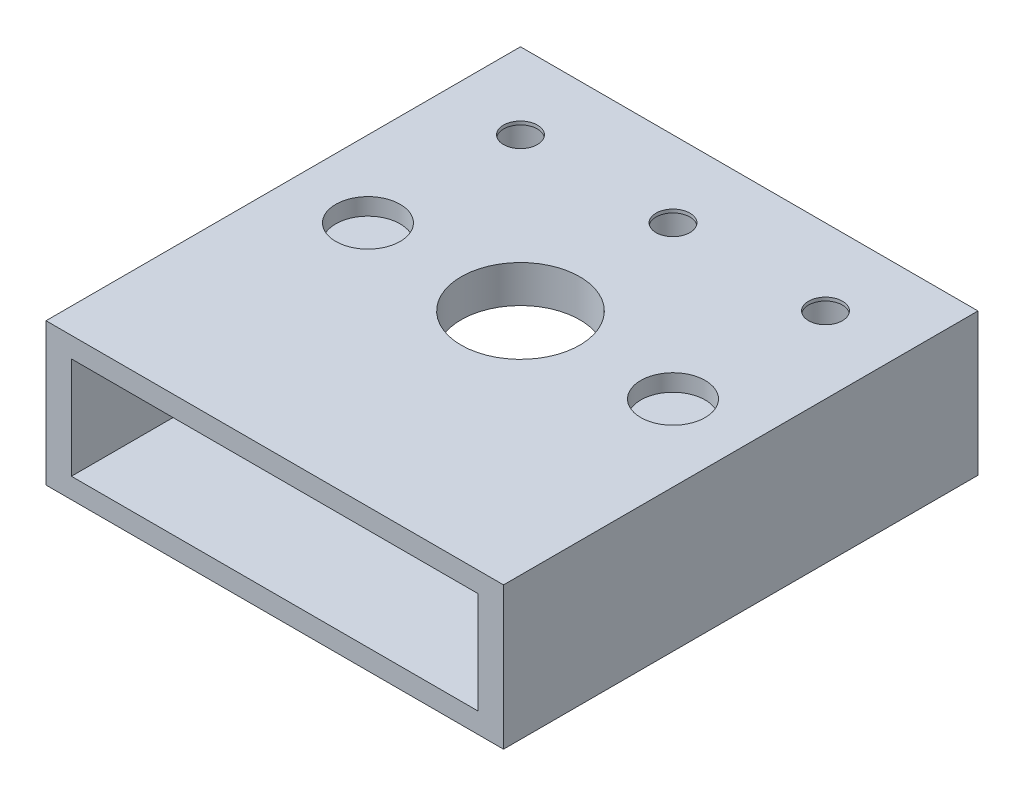
ISO-10303-21;
HEADER;
FILE_DESCRIPTION(('STEP AP214'),'2;1');
FILE_NAME('part.step','',(''),(''),'','','');
FILE_SCHEMA(('AUTOMOTIVE_DESIGN { 1 0 10303 214 1 1 1 1 }'));
ENDSEC;
DATA;
#1=APPLICATION_CONTEXT('core data for automotive mechanical design processes');
#2=APPLICATION_PROTOCOL_DEFINITION('international standard','automotive_design',2000,#1);
#3=PRODUCT_CONTEXT('',#1,'mechanical');
#4=PRODUCT('Part','Part','',(#3));
#5=PRODUCT_RELATED_PRODUCT_CATEGORY('part','',(#4));
#6=PRODUCT_DEFINITION_FORMATION('','',#4);
#7=PRODUCT_DEFINITION_CONTEXT('part definition',#1,'design');
#8=PRODUCT_DEFINITION('design','',#6,#7);
#9=PRODUCT_DEFINITION_SHAPE('','',#8);
#10=(LENGTH_UNIT() NAMED_UNIT(*) SI_UNIT(.MILLI.,.METRE.));
#11=(NAMED_UNIT(*) PLANE_ANGLE_UNIT() SI_UNIT($,.RADIAN.));
#12=(NAMED_UNIT(*) SI_UNIT($,.STERADIAN.) SOLID_ANGLE_UNIT());
#13=UNCERTAINTY_MEASURE_WITH_UNIT(LENGTH_MEASURE(1.E-05),#10,'distance_accuracy_value','');
#14=(GEOMETRIC_REPRESENTATION_CONTEXT(3) GLOBAL_UNCERTAINTY_ASSIGNED_CONTEXT((#13)) GLOBAL_UNIT_ASSIGNED_CONTEXT((#10,
#11,#12)) REPRESENTATION_CONTEXT('',''));
#15=CARTESIAN_POINT('',(0.,0.,0.));
#16=DIRECTION('',(0.,0.,1.));
#17=DIRECTION('',(1.,0.,0.));
#18=AXIS2_PLACEMENT_3D('',#15,#16,#17);
#19=CARTESIAN_POINT('',(0.,-10.,-55.142135623731));
#20=DIRECTION('',(0.,0.,1.));
#21=DIRECTION('',(1.,0.,0.));
#22=AXIS2_PLACEMENT_3D('',#19,#20,#21);
#23=CYLINDRICAL_SURFACE('',#22,5.);
#24=CARTESIAN_POINT('',(0.,-10.,60.));
#25=DIRECTION('',(0.,0.,1.));
#26=DIRECTION('',(1.,0.,0.));
#27=AXIS2_PLACEMENT_3D('',#24,#25,#26);
#28=CIRCLE('',#27,5.);
#29=CARTESIAN_POINT('',(4.99999999999997,-10.,60.));
#30=VERTEX_POINT('',#29);
#31=EDGE_CURVE('E160',#30,#30,#28,.T.);
#32=ORIENTED_EDGE('',*,*,#31,.T.);
#33=EDGE_LOOP('',(#32));
#34=FACE_BOUND('',#33,.T.);
#35=CARTESIAN_POINT('',(0.,-10.,51.));
#36=DIRECTION('',(0.,0.,-1.));
#37=DIRECTION('',(-1.,0.,0.));
#38=AXIS2_PLACEMENT_3D('',#35,#36,#37);
#39=CIRCLE('',#38,5.);
#40=CARTESIAN_POINT('',(-5.00000000000004,-10.,51.));
#41=VERTEX_POINT('',#40);
#42=EDGE_CURVE('E42',#41,#41,#39,.F.);
#43=ORIENTED_EDGE('',*,*,#42,.F.);
#44=EDGE_LOOP('',(#43));
#45=FACE_BOUND('',#44,.T.);
#46=ADVANCED_FACE('F38',(#34,#45),#23,.F.);
#47=CARTESIAN_POINT('',(40.0000000000001,-9.99999999999972,-55.142135623731));
#48=DIRECTION('',(0.,0.,1.));
#49=DIRECTION('',(1.,0.,0.));
#50=AXIS2_PLACEMENT_3D('',#47,#48,#49);
#51=CYLINDRICAL_SURFACE('',#50,4.99999999999999);
#52=CARTESIAN_POINT('',(40.0000000000001,-9.99999999999972,60.));
#53=DIRECTION('',(0.,0.,1.));
#54=DIRECTION('',(-1.,0.,0.));
#55=AXIS2_PLACEMENT_3D('',#52,#53,#54);
#56=CIRCLE('',#55,4.99999999999999);
#57=CARTESIAN_POINT('',(35.0000000000001,-9.99999999999972,60.));
#58=VERTEX_POINT('',#57);
#59=EDGE_CURVE('E352',#58,#58,#56,.T.);
#60=ORIENTED_EDGE('',*,*,#59,.T.);
#61=EDGE_LOOP('',(#60));
#62=FACE_BOUND('',#61,.T.);
#63=CARTESIAN_POINT('',(40.0000000000001,-9.99999999999972,51.));
#64=DIRECTION('',(0.,0.,-1.));
#65=DIRECTION('',(-1.,0.,0.));
#66=AXIS2_PLACEMENT_3D('',#63,#64,#65);
#67=CIRCLE('',#66,4.99999999999999);
#68=CARTESIAN_POINT('',(35.0000000000001,-9.99999999999972,51.));
#69=VERTEX_POINT('',#68);
#70=EDGE_CURVE('E340',#69,#69,#67,.F.);
#71=ORIENTED_EDGE('',*,*,#70,.F.);
#72=EDGE_LOOP('',(#71));
#73=FACE_BOUND('',#72,.T.);
#74=ADVANCED_FACE('F435',(#62,#73),#51,.F.);
#75=CARTESIAN_POINT('',(-40.,-10.,-55.142135623731));
#76=DIRECTION('',(0.,0.,1.));
#77=DIRECTION('',(1.,0.,0.));
#78=AXIS2_PLACEMENT_3D('',#75,#76,#77);
#79=CYLINDRICAL_SURFACE('',#78,5.);
#80=CARTESIAN_POINT('',(-40.,-10.,60.));
#81=DIRECTION('',(0.,0.,1.));
#82=DIRECTION('',(1.,0.,0.));
#83=AXIS2_PLACEMENT_3D('',#80,#81,#82);
#84=CIRCLE('',#83,5.);
#85=CARTESIAN_POINT('',(-35.,-10.,60.));
#86=VERTEX_POINT('',#85);
#87=EDGE_CURVE('E170',#86,#86,#84,.T.);
#88=ORIENTED_EDGE('',*,*,#87,.T.);
#89=EDGE_LOOP('',(#88));
#90=FACE_BOUND('',#89,.T.);
#91=CARTESIAN_POINT('',(-40.,-10.,51.));
#92=DIRECTION('',(0.,0.,-1.));
#93=DIRECTION('',(-1.,0.,0.));
#94=AXIS2_PLACEMENT_3D('',#91,#92,#93);
#95=CIRCLE('',#94,5.);
#96=CARTESIAN_POINT('',(-45.,-10.,51.));
#97=VERTEX_POINT('',#96);
#98=EDGE_CURVE('E337',#97,#97,#95,.F.);
#99=ORIENTED_EDGE('',*,*,#98,.F.);
#100=EDGE_LOOP('',(#99));
#101=FACE_BOUND('',#100,.T.);
#102=ADVANCED_FACE('F441',(#90,#101),#79,.F.);
#103=CARTESIAN_POINT('',(0.,0.,-22.5));
#104=DIRECTION('',(0.,1.,0.));
#105=DIRECTION('',(0.,0.,1.));
#106=AXIS2_PLACEMENT_3D('',#103,#104,#105);
#107=CYLINDRICAL_SURFACE('',#106,5.);
#108=CARTESIAN_POINT('',(0.,11.,-22.5));
#109=DIRECTION('',(0.,1.,0.));
#110=DIRECTION('',(0.,0.,1.));
#111=AXIS2_PLACEMENT_3D('',#108,#109,#110);
#112=CIRCLE('',#111,5.);
#113=CARTESIAN_POINT('',(0.,11.,-17.5));
#114=VERTEX_POINT('',#113);
#115=EDGE_CURVE('E277',#114,#114,#112,.T.);
#116=ORIENTED_EDGE('',*,*,#115,.T.);
#117=EDGE_LOOP('',(#116));
#118=FACE_BOUND('',#117,.T.);
#119=CARTESIAN_POINT('',(0.,10.,-22.5));
#120=DIRECTION('',(0.,-1.,0.));
#121=DIRECTION('',(0.,0.,-1.));
#122=AXIS2_PLACEMENT_3D('',#119,#120,#121);
#123=CIRCLE('',#122,5.);
#124=CARTESIAN_POINT('',(0.,10.,-27.5));
#125=VERTEX_POINT('',#124);
#126=EDGE_CURVE('E282',#125,#125,#123,.F.);
#127=ORIENTED_EDGE('',*,*,#126,.F.);
#128=EDGE_LOOP('',(#127));
#129=FACE_BOUND('',#128,.T.);
#130=ADVANCED_FACE('F528',(#118,#129),#107,.F.);
#131=CARTESIAN_POINT('',(44.9999999999998,0.,-22.5000000000003));
#132=DIRECTION('',(0.,1.,0.));
#133=DIRECTION('',(0.,0.,1.));
#134=AXIS2_PLACEMENT_3D('',#131,#132,#133);
#135=CYLINDRICAL_SURFACE('',#134,5.00000000000001);
#136=CARTESIAN_POINT('',(44.9999999999998,11.,-22.5000000000003));
#137=DIRECTION('',(0.,1.,0.));
#138=DIRECTION('',(0.,0.,1.));
#139=AXIS2_PLACEMENT_3D('',#136,#137,#138);
#140=CIRCLE('',#139,5.00000000000001);
#141=CARTESIAN_POINT('',(44.9999999999998,11.,-17.5000000000003));
#142=VERTEX_POINT('',#141);
#143=EDGE_CURVE('E281',#142,#142,#140,.F.);
#144=ORIENTED_EDGE('',*,*,#143,.F.);
#145=EDGE_LOOP('',(#144));
#146=FACE_BOUND('',#145,.T.);
#147=CARTESIAN_POINT('',(44.9999999999998,10.,-22.5000000000003));
#148=DIRECTION('',(0.,-1.,0.));
#149=DIRECTION('',(0.,0.,-1.));
#150=AXIS2_PLACEMENT_3D('',#147,#148,#149);
#151=CIRCLE('',#150,5.00000000000001);
#152=CARTESIAN_POINT('',(44.9999999999998,10.,-27.5000000000003));
#153=VERTEX_POINT('',#152);
#154=EDGE_CURVE('E330',#153,#153,#151,.T.);
#155=ORIENTED_EDGE('',*,*,#154,.T.);
#156=EDGE_LOOP('',(#155));
#157=FACE_BOUND('',#156,.T.);
#158=ADVANCED_FACE('F594',(#146,#157),#135,.F.);
#159=CARTESIAN_POINT('',(0.,11.,0.));
#160=DIRECTION('',(0.,1.,0.));
#161=DIRECTION('',(0.,0.,1.));
#162=AXIS2_PLACEMENT_3D('',#159,#160,#161);
#163=PLANE('',#162);
#164=CARTESIAN_POINT('',(-45.,11.,-22.5));
#165=DIRECTION('',(0.,1.,0.));
#166=DIRECTION('',(0.,0.,1.));
#167=AXIS2_PLACEMENT_3D('',#164,#165,#166);
#168=CIRCLE('',#167,5.);
#169=CARTESIAN_POINT('',(-45.,11.,-17.5));
#170=VERTEX_POINT('',#169);
#171=EDGE_CURVE('E286',#170,#170,#168,.T.);
#172=ORIENTED_EDGE('',*,*,#171,.F.);
#173=EDGE_LOOP('',(#172));
#174=FACE_BOUND('',#173,.T.);
#175=CARTESIAN_POINT('',(45.0000000000001,11.,22.4999999999997));
#176=DIRECTION('',(0.,1.,0.));
#177=DIRECTION('',(0.,0.,1.));
#178=AXIS2_PLACEMENT_3D('',#175,#176,#177);
#179=CIRCLE('',#178,9.5);
#180=CARTESIAN_POINT('',(45.0000000000001,11.,31.9999999999997));
#181=VERTEX_POINT('',#180);
#182=EDGE_CURVE('E296',#181,#181,#179,.F.);
#183=ORIENTED_EDGE('',*,*,#182,.T.);
#184=EDGE_LOOP('',(#183));
#185=FACE_BOUND('',#184,.T.);
#186=CARTESIAN_POINT('',(-44.9999999999999,11.,22.5));
#187=DIRECTION('',(0.,1.,0.));
#188=DIRECTION('',(0.,0.,1.));
#189=AXIS2_PLACEMENT_3D('',#186,#187,#188);
#190=CIRCLE('',#189,9.5);
#191=CARTESIAN_POINT('',(-44.9999999999999,11.,32.));
#192=VERTEX_POINT('',#191);
#193=EDGE_CURVE('E300',#192,#192,#190,.T.);
#194=ORIENTED_EDGE('',*,*,#193,.F.);
#195=EDGE_LOOP('',(#194));
#196=FACE_BOUND('',#195,.T.);
#197=CARTESIAN_POINT('',(0.,11.,22.5));
#198=DIRECTION('',(0.,1.,0.));
#199=DIRECTION('',(0.,0.,1.));
#200=AXIS2_PLACEMENT_3D('',#197,#198,#199);
#201=CIRCLE('',#200,17.5);
#202=CARTESIAN_POINT('',(0.,11.,40.));
#203=VERTEX_POINT('',#202);
#204=EDGE_CURVE('E307',#203,#203,#201,.T.);
#205=ORIENTED_EDGE('',*,*,#204,.F.);
#206=EDGE_LOOP('',(#205));
#207=FACE_BOUND('',#206,.T.);
#208=DIRECTION('',(0.,0.,-1.));
#209=VECTOR('',#208,1.);
#210=CARTESIAN_POINT('',(-67.5,11.,0.));
#211=LINE('',#210,#209);
#212=CARTESIAN_POINT('',(-67.5,11.,95.));
#213=VERTEX_POINT('',#212);
#214=CARTESIAN_POINT('',(-67.5,11.,-45.));
#215=VERTEX_POINT('',#214);
#216=EDGE_CURVE('E318',#213,#215,#211,.T.);
#217=ORIENTED_EDGE('',*,*,#216,.F.);
#218=DIRECTION('',(-1.,0.,0.));
#219=VECTOR('',#218,1.);
#220=CARTESIAN_POINT('',(-67.5,11.,95.));
#221=LINE('',#220,#219);
#222=CARTESIAN_POINT('',(67.5,11.,95.));
#223=VERTEX_POINT('',#222);
#224=EDGE_CURVE('E196',#223,#213,#221,.T.);
#225=ORIENTED_EDGE('',*,*,#224,.F.);
#226=DIRECTION('',(0.,0.,-1.));
#227=VECTOR('',#226,1.);
#228=CARTESIAN_POINT('',(67.5,11.,0.));
#229=LINE('',#228,#227);
#230=CARTESIAN_POINT('',(67.5,11.,-45.));
#231=VERTEX_POINT('',#230);
#232=EDGE_CURVE('E311',#223,#231,#229,.T.);
#233=ORIENTED_EDGE('',*,*,#232,.T.);
#234=DIRECTION('',(1.,0.,0.));
#235=VECTOR('',#234,1.);
#236=CARTESIAN_POINT('',(0.,11.,-45.));
#237=LINE('',#236,#235);
#238=EDGE_CURVE('E314',#215,#231,#237,.T.);
#239=ORIENTED_EDGE('',*,*,#238,.F.);
#240=EDGE_LOOP('',(#217,#225,#233,#239));
#241=FACE_BOUND('',#240,.T.);
#242=ORIENTED_EDGE('',*,*,#115,.F.);
#243=EDGE_LOOP('',(#242));
#244=FACE_BOUND('',#243,.T.);
#245=ORIENTED_EDGE('',*,*,#143,.T.);
#246=EDGE_LOOP('',(#245));
#247=FACE_BOUND('',#246,.T.);
#248=ADVANCED_FACE('F603',(#174,#185,#196,#207,#241,#244,#247),#163,.T.);
#249=CARTESIAN_POINT('',(0.,0.,0.));
#250=DIRECTION('',(0.,1.,0.));
#251=DIRECTION('',(0.,0.,1.));
#252=AXIS2_PLACEMENT_3D('',#249,#250,#251);
#253=PLANE('',#252);
#254=DIRECTION('',(1.,0.,0.));
#255=VECTOR('',#254,1.);
#256=CARTESIAN_POINT('',(-55.,0.,-41.));
#257=LINE('',#256,#255);
#258=CARTESIAN_POINT('',(-55.,0.,-41.));
#259=VERTEX_POINT('',#258);
#260=CARTESIAN_POINT('',(55.,0.,-41.));
#261=VERTEX_POINT('',#260);
#262=EDGE_CURVE('E205',#259,#261,#257,.T.);
#263=ORIENTED_EDGE('',*,*,#262,.T.);
#264=DIRECTION('',(0.,0.,1.));
#265=VECTOR('',#264,1.);
#266=CARTESIAN_POINT('',(55.,0.,-41.));
#267=LINE('',#266,#265);
#268=CARTESIAN_POINT('',(55.,0.,41.));
#269=VERTEX_POINT('',#268);
#270=EDGE_CURVE('E200',#261,#269,#267,.T.);
#271=ORIENTED_EDGE('',*,*,#270,.T.);
#272=DIRECTION('',(-1.,0.,0.));
#273=VECTOR('',#272,1.);
#274=CARTESIAN_POINT('',(-55.,0.,41.));
#275=LINE('',#274,#273);
#276=CARTESIAN_POINT('',(-55.,0.,41.));
#277=VERTEX_POINT('',#276);
#278=EDGE_CURVE('E218',#269,#277,#275,.T.);
#279=ORIENTED_EDGE('',*,*,#278,.T.);
#280=DIRECTION('',(0.,0.,-1.));
#281=VECTOR('',#280,1.);
#282=CARTESIAN_POINT('',(-55.,0.,-41.));
#283=LINE('',#282,#281);
#284=EDGE_CURVE('E222',#277,#259,#283,.T.);
#285=ORIENTED_EDGE('',*,*,#284,.T.);
#286=EDGE_LOOP('',(#263,#271,#279,#285));
#287=FACE_BOUND('',#286,.T.);
#288=CARTESIAN_POINT('',(44.9999999999998,0.,-22.5000000000003));
#289=DIRECTION('',(0.,-1.,0.));
#290=DIRECTION('',(0.,0.,-1.));
#291=AXIS2_PLACEMENT_3D('',#288,#289,#290);
#292=CIRCLE('',#291,8.);
#293=CARTESIAN_POINT('',(44.9999999999998,0.,-30.5000000000003));
#294=VERTEX_POINT('',#293);
#295=EDGE_CURVE('E258',#294,#294,#292,.T.);
#296=ORIENTED_EDGE('',*,*,#295,.F.);
#297=EDGE_LOOP('',(#296));
#298=FACE_BOUND('',#297,.T.);
#299=CARTESIAN_POINT('',(0.,0.,-22.5));
#300=DIRECTION('',(0.,-1.,0.));
#301=DIRECTION('',(0.,0.,-1.));
#302=AXIS2_PLACEMENT_3D('',#299,#300,#301);
#303=CIRCLE('',#302,8.);
#304=CARTESIAN_POINT('',(0.,0.,-30.5));
#305=VERTEX_POINT('',#304);
#306=EDGE_CURVE('E266',#305,#305,#303,.T.);
#307=ORIENTED_EDGE('',*,*,#306,.F.);
#308=EDGE_LOOP('',(#307));
#309=FACE_BOUND('',#308,.T.);
#310=CARTESIAN_POINT('',(-44.9999999999997,0.,-22.5000000000006));
#311=DIRECTION('',(0.,-1.,0.));
#312=DIRECTION('',(0.,0.,1.));
#313=AXIS2_PLACEMENT_3D('',#310,#311,#312);
#314=CIRCLE('',#313,7.99999999999999);
#315=CARTESIAN_POINT('',(-44.9999999999997,0.,-14.5000000000006));
#316=VERTEX_POINT('',#315);
#317=EDGE_CURVE('E252',#316,#316,#314,.T.);
#318=ORIENTED_EDGE('',*,*,#317,.F.);
#319=EDGE_LOOP('',(#318));
#320=FACE_BOUND('',#319,.T.);
#321=CARTESIAN_POINT('',(0.,0.,22.5));
#322=DIRECTION('',(0.,1.,0.));
#323=DIRECTION('',(0.,0.,1.));
#324=AXIS2_PLACEMENT_3D('',#321,#322,#323);
#325=CIRCLE('',#324,17.5);
#326=CARTESIAN_POINT('',(0.,0.,40.));
#327=VERTEX_POINT('',#326);
#328=EDGE_CURVE('E295',#327,#327,#325,.T.);
#329=ORIENTED_EDGE('',*,*,#328,.T.);
#330=EDGE_LOOP('',(#329));
#331=FACE_BOUND('',#330,.T.);
#332=ADVANCED_FACE('F412',(#287,#298,#309,#320,#331),#253,.F.);
#333=CARTESIAN_POINT('',(67.5,11.,0.));
#334=DIRECTION('',(-1.,0.,0.));
#335=DIRECTION('',(0.,0.,1.));
#336=AXIS2_PLACEMENT_3D('',#333,#334,#335);
#337=PLANE('',#336);
#338=ORIENTED_EDGE('',*,*,#232,.F.);
#339=DIRECTION('',(0.,1.,0.));
#340=VECTOR('',#339,1.);
#341=CARTESIAN_POINT('',(67.5,11.,95.));
#342=LINE('',#341,#340);
#343=CARTESIAN_POINT('',(67.5,-31.,95.));
#344=VERTEX_POINT('',#343);
#345=EDGE_CURVE('E192',#344,#223,#342,.T.);
#346=ORIENTED_EDGE('',*,*,#345,.F.);
#347=DIRECTION('',(0.,0.,1.));
#348=VECTOR('',#347,1.);
#349=CARTESIAN_POINT('',(67.5,-31.,45.));
#350=LINE('',#349,#348);
#351=CARTESIAN_POINT('',(67.5,-31.,-45.));
#352=VERTEX_POINT('',#351);
#353=EDGE_CURVE('E249',#352,#344,#350,.T.);
#354=ORIENTED_EDGE('',*,*,#353,.F.);
#355=DIRECTION('',(0.,-1.,0.));
#356=VECTOR('',#355,1.);
#357=CARTESIAN_POINT('',(67.5,11.,-45.));
#358=LINE('',#357,#356);
#359=EDGE_CURVE('E11',#231,#352,#358,.T.);
#360=ORIENTED_EDGE('',*,*,#359,.F.);
#361=EDGE_LOOP('',(#338,#346,#354,#360));
#362=FACE_BOUND('',#361,.T.);
#363=ADVANCED_FACE('F632',(#362),#337,.F.);
#364=CARTESIAN_POINT('',(0.,11.,-45.));
#365=DIRECTION('',(0.,0.,-1.));
#366=DIRECTION('',(-1.,0.,0.));
#367=AXIS2_PLACEMENT_3D('',#364,#365,#366);
#368=PLANE('',#367);
#369=ORIENTED_EDGE('',*,*,#359,.T.);
#370=DIRECTION('',(1.,0.,0.));
#371=VECTOR('',#370,1.);
#372=CARTESIAN_POINT('',(-67.5,-31.,-45.));
#373=LINE('',#372,#371);
#374=CARTESIAN_POINT('',(-67.5,-31.,-45.));
#375=VERTEX_POINT('',#374);
#376=EDGE_CURVE('E245',#375,#352,#373,.T.);
#377=ORIENTED_EDGE('',*,*,#376,.F.);
#378=DIRECTION('',(0.,-1.,0.));
#379=VECTOR('',#378,1.);
#380=CARTESIAN_POINT('',(-67.5,11.,-45.));
#381=LINE('',#380,#379);
#382=EDGE_CURVE('E48',#215,#375,#381,.T.);
#383=ORIENTED_EDGE('',*,*,#382,.F.);
#384=ORIENTED_EDGE('',*,*,#238,.T.);
#385=EDGE_LOOP('',(#369,#377,#383,#384));
#386=FACE_BOUND('',#385,.T.);
#387=ADVANCED_FACE('F635',(#386),#368,.T.);
#388=CARTESIAN_POINT('',(0.,11.,22.5));
#389=DIRECTION('',(0.,-1.,0.));
#390=DIRECTION('',(0.,0.,-1.));
#391=AXIS2_PLACEMENT_3D('',#388,#389,#390);
#392=CYLINDRICAL_SURFACE('',#391,17.5);
#393=ORIENTED_EDGE('',*,*,#204,.T.);
#394=EDGE_LOOP('',(#393));
#395=FACE_BOUND('',#394,.T.);
#396=ORIENTED_EDGE('',*,*,#328,.F.);
#397=EDGE_LOOP('',(#396));
#398=FACE_BOUND('',#397,.T.);
#399=ADVANCED_FACE('F40',(#395,#398),#392,.F.);
#400=CARTESIAN_POINT('',(-67.5,11.,0.));
#401=DIRECTION('',(-1.,0.,0.));
#402=DIRECTION('',(0.,0.,1.));
#403=AXIS2_PLACEMENT_3D('',#400,#401,#402);
#404=PLANE('',#403);
#405=ORIENTED_EDGE('',*,*,#382,.T.);
#406=DIRECTION('',(0.,0.,-1.));
#407=VECTOR('',#406,1.);
#408=CARTESIAN_POINT('',(-67.5,-31.,45.));
#409=LINE('',#408,#407);
#410=CARTESIAN_POINT('',(-67.5,-31.,95.));
#411=VERTEX_POINT('',#410);
#412=EDGE_CURVE('E241',#411,#375,#409,.T.);
#413=ORIENTED_EDGE('',*,*,#412,.F.);
#414=DIRECTION('',(0.,-1.,0.));
#415=VECTOR('',#414,1.);
#416=CARTESIAN_POINT('',(-67.5,11.,95.));
#417=LINE('',#416,#415);
#418=EDGE_CURVE('E179',#213,#411,#417,.T.);
#419=ORIENTED_EDGE('',*,*,#418,.F.);
#420=ORIENTED_EDGE('',*,*,#216,.T.);
#421=EDGE_LOOP('',(#405,#413,#419,#420));
#422=FACE_BOUND('',#421,.T.);
#423=ADVANCED_FACE('F622',(#422),#404,.T.);
#424=CARTESIAN_POINT('',(-44.9999999999999,6.,22.5));
#425=DIRECTION('',(0.,1.,0.));
#426=DIRECTION('',(0.,0.,1.));
#427=AXIS2_PLACEMENT_3D('',#424,#425,#426);
#428=CYLINDRICAL_SURFACE('',#427,9.5);
#429=CARTESIAN_POINT('',(-44.9999999999999,6.,22.5));
#430=DIRECTION('',(0.,1.,0.));
#431=DIRECTION('',(0.,0.,1.));
#432=AXIS2_PLACEMENT_3D('',#429,#430,#431);
#433=CIRCLE('',#432,9.5);
#434=CARTESIAN_POINT('',(-44.9999999999999,6.,32.));
#435=VERTEX_POINT('',#434);
#436=EDGE_CURVE('E290',#435,#435,#433,.T.);
#437=ORIENTED_EDGE('',*,*,#436,.F.);
#438=EDGE_LOOP('',(#437));
#439=FACE_BOUND('',#438,.T.);
#440=ORIENTED_EDGE('',*,*,#193,.T.);
#441=EDGE_LOOP('',(#440));
#442=FACE_BOUND('',#441,.T.);
#443=ADVANCED_FACE('F619',(#439,#442),#428,.F.);
#444=CARTESIAN_POINT('',(-44.9999999999999,6.,22.5));
#445=DIRECTION('',(0.,1.,0.));
#446=DIRECTION('',(0.,0.,1.));
#447=AXIS2_PLACEMENT_3D('',#444,#445,#446);
#448=PLANE('',#447);
#449=ORIENTED_EDGE('',*,*,#436,.T.);
#450=EDGE_LOOP('',(#449));
#451=FACE_BOUND('',#450,.T.);
#452=ADVANCED_FACE('F617',(#451),#448,.T.);
#453=CARTESIAN_POINT('',(45.0000000000001,6.,22.4999999999997));
#454=DIRECTION('',(0.,1.,0.));
#455=DIRECTION('',(0.,0.,1.));
#456=AXIS2_PLACEMENT_3D('',#453,#454,#455);
#457=CYLINDRICAL_SURFACE('',#456,9.5);
#458=CARTESIAN_POINT('',(45.0000000000001,6.,22.4999999999997));
#459=DIRECTION('',(0.,1.,0.));
#460=DIRECTION('',(0.,0.,1.));
#461=AXIS2_PLACEMENT_3D('',#458,#459,#460);
#462=CIRCLE('',#461,9.5);
#463=CARTESIAN_POINT('',(45.0000000000001,6.,31.9999999999997));
#464=VERTEX_POINT('',#463);
#465=EDGE_CURVE('E291',#464,#464,#462,.F.);
#466=ORIENTED_EDGE('',*,*,#465,.T.);
#467=EDGE_LOOP('',(#466));
#468=FACE_BOUND('',#467,.T.);
#469=ORIENTED_EDGE('',*,*,#182,.F.);
#470=EDGE_LOOP('',(#469));
#471=FACE_BOUND('',#470,.T.);
#472=ADVANCED_FACE('F613',(#468,#471),#457,.F.);
#473=CARTESIAN_POINT('',(0.,6.,0.));
#474=DIRECTION('',(0.,1.,0.));
#475=DIRECTION('',(0.,0.,1.));
#476=AXIS2_PLACEMENT_3D('',#473,#474,#475);
#477=PLANE('',#476);
#478=ORIENTED_EDGE('',*,*,#465,.F.);
#479=EDGE_LOOP('',(#478));
#480=FACE_BOUND('',#479,.T.);
#481=ADVANCED_FACE('F610',(#480),#477,.T.);
#482=CARTESIAN_POINT('',(-45.,0.,-22.5));
#483=DIRECTION('',(0.,1.,0.));
#484=DIRECTION('',(0.,0.,1.));
#485=AXIS2_PLACEMENT_3D('',#482,#483,#484);
#486=CYLINDRICAL_SURFACE('',#485,5.);
#487=CARTESIAN_POINT('',(-45.,10.,-22.5));
#488=DIRECTION('',(0.,1.,0.));
#489=DIRECTION('',(0.,0.,1.));
#490=AXIS2_PLACEMENT_3D('',#487,#488,#489);
#491=CIRCLE('',#490,5.);
#492=CARTESIAN_POINT('',(-45.,10.,-17.5));
#493=VERTEX_POINT('',#492);
#494=EDGE_CURVE('E257',#493,#493,#491,.F.);
#495=ORIENTED_EDGE('',*,*,#494,.T.);
#496=EDGE_LOOP('',(#495));
#497=FACE_BOUND('',#496,.T.);
#498=ORIENTED_EDGE('',*,*,#171,.T.);
#499=EDGE_LOOP('',(#498));
#500=FACE_BOUND('',#499,.T.);
#501=ADVANCED_FACE('F609',(#497,#500),#486,.F.);
#502=CARTESIAN_POINT('',(-44.9999999999997,10.,-22.5000000000006));
#503=DIRECTION('',(0.,1.,0.));
#504=DIRECTION('',(0.,0.,1.));
#505=AXIS2_PLACEMENT_3D('',#502,#503,#504);
#506=PLANE('',#505);
#507=CARTESIAN_POINT('',(-44.9999999999997,10.,-22.5000000000006));
#508=DIRECTION('',(0.,-1.,0.));
#509=DIRECTION('',(0.,0.,1.));
#510=AXIS2_PLACEMENT_3D('',#507,#508,#509);
#511=CIRCLE('',#510,7.99999999999999);
#512=CARTESIAN_POINT('',(-44.9999999999997,10.,-14.5000000000006));
#513=VERTEX_POINT('',#512);
#514=EDGE_CURVE('E270',#513,#513,#511,.T.);
#515=ORIENTED_EDGE('',*,*,#514,.T.);
#516=EDGE_LOOP('',(#515));
#517=FACE_BOUND('',#516,.T.);
#518=ORIENTED_EDGE('',*,*,#494,.F.);
#519=EDGE_LOOP('',(#518));
#520=FACE_BOUND('',#519,.T.);
#521=ADVANCED_FACE('F708',(#517,#520),#506,.F.);
#522=CARTESIAN_POINT('',(-44.9999999999997,10.,-22.5000000000006));
#523=DIRECTION('',(0.,-1.,0.));
#524=DIRECTION('',(0.,0.,-1.));
#525=AXIS2_PLACEMENT_3D('',#522,#523,#524);
#526=CYLINDRICAL_SURFACE('',#525,7.99999999999999);
#527=ORIENTED_EDGE('',*,*,#514,.F.);
#528=EDGE_LOOP('',(#527));
#529=FACE_BOUND('',#528,.T.);
#530=ORIENTED_EDGE('',*,*,#317,.T.);
#531=EDGE_LOOP('',(#530));
#532=FACE_BOUND('',#531,.T.);
#533=ADVANCED_FACE('F667',(#529,#532),#526,.F.);
#534=CARTESIAN_POINT('',(44.9999999999998,10.,-22.5000000000003));
#535=DIRECTION('',(0.,-1.,0.));
#536=DIRECTION('',(0.,0.,-1.));
#537=AXIS2_PLACEMENT_3D('',#534,#535,#536);
#538=CYLINDRICAL_SURFACE('',#537,8.);
#539=CARTESIAN_POINT('',(44.9999999999998,10.,-22.5000000000003));
#540=DIRECTION('',(0.,-1.,0.));
#541=DIRECTION('',(0.,0.,-1.));
#542=AXIS2_PLACEMENT_3D('',#539,#540,#541);
#543=CIRCLE('',#542,8.);
#544=CARTESIAN_POINT('',(44.9999999999998,10.,-30.5000000000003));
#545=VERTEX_POINT('',#544);
#546=EDGE_CURVE('E253',#545,#545,#543,.T.);
#547=ORIENTED_EDGE('',*,*,#546,.F.);
#548=EDGE_LOOP('',(#547));
#549=FACE_BOUND('',#548,.T.);
#550=ORIENTED_EDGE('',*,*,#295,.T.);
#551=EDGE_LOOP('',(#550));
#552=FACE_BOUND('',#551,.T.);
#553=ADVANCED_FACE('F662',(#549,#552),#538,.F.);
#554=CARTESIAN_POINT('',(44.9999999999998,10.,-22.5000000000003));
#555=DIRECTION('',(0.,-1.,0.));
#556=DIRECTION('',(0.,0.,-1.));
#557=AXIS2_PLACEMENT_3D('',#554,#555,#556);
#558=PLANE('',#557);
#559=ORIENTED_EDGE('',*,*,#154,.F.);
#560=EDGE_LOOP('',(#559));
#561=FACE_BOUND('',#560,.T.);
#562=ORIENTED_EDGE('',*,*,#546,.T.);
#563=EDGE_LOOP('',(#562));
#564=FACE_BOUND('',#563,.T.);
#565=ADVANCED_FACE('F659',(#561,#564),#558,.T.);
#566=CARTESIAN_POINT('',(0.,10.,-22.5));
#567=DIRECTION('',(0.,-1.,0.));
#568=DIRECTION('',(0.,0.,-1.));
#569=AXIS2_PLACEMENT_3D('',#566,#567,#568);
#570=PLANE('',#569);
#571=CARTESIAN_POINT('',(0.,10.,-22.5));
#572=DIRECTION('',(0.,-1.,0.));
#573=DIRECTION('',(0.,0.,-1.));
#574=AXIS2_PLACEMENT_3D('',#571,#572,#573);
#575=CIRCLE('',#574,8.);
#576=CARTESIAN_POINT('',(0.,10.,-30.5));
#577=VERTEX_POINT('',#576);
#578=EDGE_CURVE('E262',#577,#577,#575,.T.);
#579=ORIENTED_EDGE('',*,*,#578,.T.);
#580=EDGE_LOOP('',(#579));
#581=FACE_BOUND('',#580,.T.);
#582=ORIENTED_EDGE('',*,*,#126,.T.);
#583=EDGE_LOOP('',(#582));
#584=FACE_BOUND('',#583,.T.);
#585=ADVANCED_FACE('F430',(#581,#584),#570,.T.);
#586=CARTESIAN_POINT('',(0.,10.,-22.5));
#587=DIRECTION('',(0.,-1.,0.));
#588=DIRECTION('',(0.,0.,-1.));
#589=AXIS2_PLACEMENT_3D('',#586,#587,#588);
#590=CYLINDRICAL_SURFACE('',#589,8.);
#591=ORIENTED_EDGE('',*,*,#578,.F.);
#592=EDGE_LOOP('',(#591));
#593=FACE_BOUND('',#592,.T.);
#594=ORIENTED_EDGE('',*,*,#306,.T.);
#595=EDGE_LOOP('',(#594));
#596=FACE_BOUND('',#595,.T.);
#597=ADVANCED_FACE('F421',(#593,#596),#590,.F.);
#598=CARTESIAN_POINT('',(0.,-31.,0.));
#599=DIRECTION('',(0.,-1.,0.));
#600=DIRECTION('',(0.,0.,-1.));
#601=AXIS2_PLACEMENT_3D('',#598,#599,#600);
#602=PLANE('',#601);
#603=ORIENTED_EDGE('',*,*,#412,.T.);
#604=ORIENTED_EDGE('',*,*,#376,.T.);
#605=ORIENTED_EDGE('',*,*,#353,.T.);
#606=DIRECTION('',(1.,0.,0.));
#607=VECTOR('',#606,1.);
#608=CARTESIAN_POINT('',(-67.5,-31.,95.));
#609=LINE('',#608,#607);
#610=EDGE_CURVE('E188',#411,#344,#609,.T.);
#611=ORIENTED_EDGE('',*,*,#610,.F.);
#612=EDGE_LOOP('',(#603,#604,#605,#611));
#613=FACE_BOUND('',#612,.T.);
#614=DIRECTION('',(-1.,0.,0.));
#615=VECTOR('',#614,1.);
#616=CARTESIAN_POINT('',(-55.,-31.,41.));
#617=LINE('',#616,#615);
#618=CARTESIAN_POINT('',(55.,-31.,41.));
#619=VERTEX_POINT('',#618);
#620=CARTESIAN_POINT('',(-55.,-31.,41.));
#621=VERTEX_POINT('',#620);
#622=EDGE_CURVE('E204',#619,#621,#617,.T.);
#623=ORIENTED_EDGE('',*,*,#622,.F.);
#624=DIRECTION('',(0.,0.,1.));
#625=VECTOR('',#624,1.);
#626=CARTESIAN_POINT('',(55.,-31.,-41.));
#627=LINE('',#626,#625);
#628=CARTESIAN_POINT('',(55.,-31.,-41.));
#629=VERTEX_POINT('',#628);
#630=EDGE_CURVE('E201',#629,#619,#627,.T.);
#631=ORIENTED_EDGE('',*,*,#630,.F.);
#632=DIRECTION('',(1.,0.,0.));
#633=VECTOR('',#632,1.);
#634=CARTESIAN_POINT('',(-55.,-31.,-41.));
#635=LINE('',#634,#633);
#636=CARTESIAN_POINT('',(-55.,-31.,-41.));
#637=VERTEX_POINT('',#636);
#638=EDGE_CURVE('E212',#637,#629,#635,.T.);
#639=ORIENTED_EDGE('',*,*,#638,.F.);
#640=DIRECTION('',(0.,0.,-1.));
#641=VECTOR('',#640,1.);
#642=CARTESIAN_POINT('',(-55.,-31.,-41.));
#643=LINE('',#642,#641);
#644=EDGE_CURVE('E208',#621,#637,#643,.T.);
#645=ORIENTED_EDGE('',*,*,#644,.F.);
#646=EDGE_LOOP('',(#623,#631,#639,#645));
#647=FACE_BOUND('',#646,.T.);
#648=ADVANCED_FACE('F419',(#613,#647),#602,.T.);
#649=CARTESIAN_POINT('',(55.,-31.,-41.));
#650=DIRECTION('',(-1.,0.,0.));
#651=DIRECTION('',(0.,0.,1.));
#652=AXIS2_PLACEMENT_3D('',#649,#650,#651);
#653=PLANE('',#652);
#654=ORIENTED_EDGE('',*,*,#270,.F.);
#655=DIRECTION('',(0.,1.,0.));
#656=VECTOR('',#655,1.);
#657=CARTESIAN_POINT('',(55.,-31.,-41.));
#658=LINE('',#657,#656);
#659=EDGE_CURVE('E64',#629,#261,#658,.T.);
#660=ORIENTED_EDGE('',*,*,#659,.F.);
#661=ORIENTED_EDGE('',*,*,#630,.T.);
#662=DIRECTION('',(0.,1.,0.));
#663=VECTOR('',#662,1.);
#664=CARTESIAN_POINT('',(55.,-31.,41.));
#665=LINE('',#664,#663);
#666=EDGE_CURVE('E237',#619,#269,#665,.T.);
#667=ORIENTED_EDGE('',*,*,#666,.T.);
#668=EDGE_LOOP('',(#654,#660,#661,#667));
#669=FACE_BOUND('',#668,.T.);
#670=ADVANCED_FACE('F400',(#669),#653,.T.);
#671=CARTESIAN_POINT('',(-55.,-31.,41.));
#672=DIRECTION('',(0.,0.,-1.));
#673=DIRECTION('',(-1.,0.,0.));
#674=AXIS2_PLACEMENT_3D('',#671,#672,#673);
#675=PLANE('',#674);
#676=CARTESIAN_POINT('',(-40.,-10.,41.));
#677=DIRECTION('',(0.,0.,-1.));
#678=DIRECTION('',(-1.,0.,0.));
#679=AXIS2_PLACEMENT_3D('',#676,#677,#678);
#680=CIRCLE('',#679,8.00000000000001);
#681=CARTESIAN_POINT('',(-48.,-10.,41.));
#682=VERTEX_POINT('',#681);
#683=EDGE_CURVE('E371',#682,#682,#680,.T.);
#684=ORIENTED_EDGE('',*,*,#683,.F.);
#685=EDGE_LOOP('',(#684));
#686=FACE_BOUND('',#685,.T.);
#687=CARTESIAN_POINT('',(40.0000000000001,-9.99999999999972,41.));
#688=DIRECTION('',(0.,0.,-1.));
#689=DIRECTION('',(-1.,0.,0.));
#690=AXIS2_PLACEMENT_3D('',#687,#688,#689);
#691=CIRCLE('',#690,8.00000000000001);
#692=CARTESIAN_POINT('',(32.0000000000001,-9.99999999999972,41.));
#693=VERTEX_POINT('',#692);
#694=EDGE_CURVE('E379',#693,#693,#691,.T.);
#695=ORIENTED_EDGE('',*,*,#694,.F.);
#696=EDGE_LOOP('',(#695));
#697=FACE_BOUND('',#696,.T.);
#698=CARTESIAN_POINT('',(0.,-10.,41.));
#699=DIRECTION('',(0.,0.,-1.));
#700=DIRECTION('',(-1.,0.,0.));
#701=AXIS2_PLACEMENT_3D('',#698,#699,#700);
#702=CIRCLE('',#701,8.);
#703=CARTESIAN_POINT('',(-8.00000000000004,-10.,41.));
#704=VERTEX_POINT('',#703);
#705=EDGE_CURVE('E363',#704,#704,#702,.T.);
#706=ORIENTED_EDGE('',*,*,#705,.F.);
#707=EDGE_LOOP('',(#706));
#708=FACE_BOUND('',#707,.T.);
#709=ORIENTED_EDGE('',*,*,#278,.F.);
#710=ORIENTED_EDGE('',*,*,#666,.F.);
#711=ORIENTED_EDGE('',*,*,#622,.T.);
#712=DIRECTION('',(0.,1.,0.));
#713=VECTOR('',#712,1.);
#714=CARTESIAN_POINT('',(-55.,-31.,41.));
#715=LINE('',#714,#713);
#716=EDGE_CURVE('E234',#621,#277,#715,.T.);
#717=ORIENTED_EDGE('',*,*,#716,.T.);
#718=EDGE_LOOP('',(#709,#710,#711,#717));
#719=FACE_BOUND('',#718,.T.);
#720=ADVANCED_FACE('F396',(#686,#697,#708,#719),#675,.T.);
#721=CARTESIAN_POINT('',(-55.,-31.,-41.));
#722=DIRECTION('',(1.,0.,0.));
#723=DIRECTION('',(0.,0.,-1.));
#724=AXIS2_PLACEMENT_3D('',#721,#722,#723);
#725=PLANE('',#724);
#726=ORIENTED_EDGE('',*,*,#284,.F.);
#727=ORIENTED_EDGE('',*,*,#716,.F.);
#728=ORIENTED_EDGE('',*,*,#644,.T.);
#729=DIRECTION('',(0.,1.,0.));
#730=VECTOR('',#729,1.);
#731=CARTESIAN_POINT('',(-55.,-31.,-41.));
#732=LINE('',#731,#730);
#733=EDGE_CURVE('E231',#637,#259,#732,.T.);
#734=ORIENTED_EDGE('',*,*,#733,.T.);
#735=EDGE_LOOP('',(#726,#727,#728,#734));
#736=FACE_BOUND('',#735,.T.);
#737=ADVANCED_FACE('F399',(#736),#725,.T.);
#738=CARTESIAN_POINT('',(-55.,-31.,-41.));
#739=DIRECTION('',(0.,0.,1.));
#740=DIRECTION('',(1.,0.,0.));
#741=AXIS2_PLACEMENT_3D('',#738,#739,#740);
#742=PLANE('',#741);
#743=ORIENTED_EDGE('',*,*,#262,.F.);
#744=ORIENTED_EDGE('',*,*,#733,.F.);
#745=ORIENTED_EDGE('',*,*,#638,.T.);
#746=ORIENTED_EDGE('',*,*,#659,.T.);
#747=EDGE_LOOP('',(#743,#744,#745,#746));
#748=FACE_BOUND('',#747,.T.);
#749=ADVANCED_FACE('F414',(#748),#742,.T.);
#750=CARTESIAN_POINT('',(0.,0.,95.));
#751=DIRECTION('',(0.,0.,1.));
#752=DIRECTION('',(1.,0.,0.));
#753=AXIS2_PLACEMENT_3D('',#750,#751,#752);
#754=PLANE('',#753);
#755=DIRECTION('',(0.,-1.,0.));
#756=VECTOR('',#755,1.);
#757=CARTESIAN_POINT('',(-60.,-25.,95.));
#758=LINE('',#757,#756);
#759=CARTESIAN_POINT('',(-60.,4.99999999999999,95.));
#760=VERTEX_POINT('',#759);
#761=CARTESIAN_POINT('',(-60.,-25.,95.));
#762=VERTEX_POINT('',#761);
#763=EDGE_CURVE('E56',#760,#762,#758,.T.);
#764=ORIENTED_EDGE('',*,*,#763,.F.);
#765=DIRECTION('',(-1.,0.,0.));
#766=VECTOR('',#765,1.);
#767=CARTESIAN_POINT('',(60.,5.00000000000001,95.));
#768=LINE('',#767,#766);
#769=CARTESIAN_POINT('',(60.,5.00000000000001,95.));
#770=VERTEX_POINT('',#769);
#771=EDGE_CURVE('E153',#770,#760,#768,.T.);
#772=ORIENTED_EDGE('',*,*,#771,.F.);
#773=DIRECTION('',(0.,1.,0.));
#774=VECTOR('',#773,1.);
#775=CARTESIAN_POINT('',(60.,-25.,95.));
#776=LINE('',#775,#774);
#777=CARTESIAN_POINT('',(60.,-25.,95.));
#778=VERTEX_POINT('',#777);
#779=EDGE_CURVE('E157',#778,#770,#776,.T.);
#780=ORIENTED_EDGE('',*,*,#779,.F.);
#781=DIRECTION('',(1.,0.,0.));
#782=VECTOR('',#781,1.);
#783=CARTESIAN_POINT('',(60.,-25.,95.));
#784=LINE('',#783,#782);
#785=EDGE_CURVE('E169',#762,#778,#784,.T.);
#786=ORIENTED_EDGE('',*,*,#785,.F.);
#787=EDGE_LOOP('',(#764,#772,#780,#786));
#788=FACE_BOUND('',#787,.T.);
#789=ORIENTED_EDGE('',*,*,#418,.T.);
#790=ORIENTED_EDGE('',*,*,#610,.T.);
#791=ORIENTED_EDGE('',*,*,#345,.T.);
#792=ORIENTED_EDGE('',*,*,#224,.T.);
#793=EDGE_LOOP('',(#789,#790,#791,#792));
#794=FACE_BOUND('',#793,.T.);
#795=ADVANCED_FACE('F462',(#788,#794),#754,.T.);
#796=CARTESIAN_POINT('',(-60.,-25.,60.));
#797=DIRECTION('',(-1.,0.,0.));
#798=DIRECTION('',(0.,0.,1.));
#799=AXIS2_PLACEMENT_3D('',#796,#797,#798);
#800=PLANE('',#799);
#801=ORIENTED_EDGE('',*,*,#763,.T.);
#802=DIRECTION('',(0.,0.,1.));
#803=VECTOR('',#802,1.);
#804=CARTESIAN_POINT('',(-60.,-25.,60.));
#805=LINE('',#804,#803);
#806=CARTESIAN_POINT('',(-60.,-25.,60.));
#807=VERTEX_POINT('',#806);
#808=EDGE_CURVE('E128',#807,#762,#805,.T.);
#809=ORIENTED_EDGE('',*,*,#808,.F.);
#810=DIRECTION('',(0.,-1.,0.));
#811=VECTOR('',#810,1.);
#812=CARTESIAN_POINT('',(-60.,-25.,60.));
#813=LINE('',#812,#811);
#814=CARTESIAN_POINT('',(-60.,4.99999999999999,60.));
#815=VERTEX_POINT('',#814);
#816=EDGE_CURVE('E132',#815,#807,#813,.T.);
#817=ORIENTED_EDGE('',*,*,#816,.F.);
#818=DIRECTION('',(0.,0.,1.));
#819=VECTOR('',#818,1.);
#820=CARTESIAN_POINT('',(-60.,4.99999999999999,60.));
#821=LINE('',#820,#819);
#822=EDGE_CURVE('E176',#815,#760,#821,.T.);
#823=ORIENTED_EDGE('',*,*,#822,.T.);
#824=EDGE_LOOP('',(#801,#809,#817,#823));
#825=FACE_BOUND('',#824,.T.);
#826=ADVANCED_FACE('F130',(#825),#800,.F.);
#827=CARTESIAN_POINT('',(60.,5.00000000000001,60.));
#828=DIRECTION('',(0.,1.,0.));
#829=DIRECTION('',(-1.,0.,0.));
#830=AXIS2_PLACEMENT_3D('',#827,#828,#829);
#831=PLANE('',#830);
#832=ORIENTED_EDGE('',*,*,#771,.T.);
#833=ORIENTED_EDGE('',*,*,#822,.F.);
#834=DIRECTION('',(-1.,0.,0.));
#835=VECTOR('',#834,1.);
#836=CARTESIAN_POINT('',(60.,5.00000000000001,60.));
#837=LINE('',#836,#835);
#838=CARTESIAN_POINT('',(60.,5.00000000000001,60.));
#839=VERTEX_POINT('',#838);
#840=EDGE_CURVE('E139',#839,#815,#837,.T.);
#841=ORIENTED_EDGE('',*,*,#840,.F.);
#842=DIRECTION('',(0.,0.,1.));
#843=VECTOR('',#842,1.);
#844=CARTESIAN_POINT('',(60.,5.00000000000001,60.));
#845=LINE('',#844,#843);
#846=EDGE_CURVE('E180',#839,#770,#845,.T.);
#847=ORIENTED_EDGE('',*,*,#846,.T.);
#848=EDGE_LOOP('',(#832,#833,#841,#847));
#849=FACE_BOUND('',#848,.T.);
#850=ADVANCED_FACE('F450',(#849),#831,.F.);
#851=CARTESIAN_POINT('',(60.,-25.,60.));
#852=DIRECTION('',(1.,0.,0.));
#853=DIRECTION('',(0.,1.,0.));
#854=AXIS2_PLACEMENT_3D('',#851,#852,#853);
#855=PLANE('',#854);
#856=ORIENTED_EDGE('',*,*,#779,.T.);
#857=ORIENTED_EDGE('',*,*,#846,.F.);
#858=DIRECTION('',(0.,1.,0.));
#859=VECTOR('',#858,1.);
#860=CARTESIAN_POINT('',(60.,-25.,60.));
#861=LINE('',#860,#859);
#862=CARTESIAN_POINT('',(60.,-25.,60.));
#863=VERTEX_POINT('',#862);
#864=EDGE_CURVE('E148',#863,#839,#861,.T.);
#865=ORIENTED_EDGE('',*,*,#864,.F.);
#866=DIRECTION('',(0.,0.,1.));
#867=VECTOR('',#866,1.);
#868=CARTESIAN_POINT('',(60.,-25.,60.));
#869=LINE('',#868,#867);
#870=EDGE_CURVE('E138',#863,#778,#869,.T.);
#871=ORIENTED_EDGE('',*,*,#870,.T.);
#872=EDGE_LOOP('',(#856,#857,#865,#871));
#873=FACE_BOUND('',#872,.T.);
#874=ADVANCED_FACE('F453',(#873),#855,.F.);
#875=CARTESIAN_POINT('',(60.,-25.,60.));
#876=DIRECTION('',(0.,-1.,0.));
#877=DIRECTION('',(1.,0.,0.));
#878=AXIS2_PLACEMENT_3D('',#875,#876,#877);
#879=PLANE('',#878);
#880=ORIENTED_EDGE('',*,*,#785,.T.);
#881=ORIENTED_EDGE('',*,*,#870,.F.);
#882=DIRECTION('',(1.,0.,0.));
#883=VECTOR('',#882,1.);
#884=CARTESIAN_POINT('',(60.,-25.,60.));
#885=LINE('',#884,#883);
#886=EDGE_CURVE('E142',#807,#863,#885,.T.);
#887=ORIENTED_EDGE('',*,*,#886,.F.);
#888=ORIENTED_EDGE('',*,*,#808,.T.);
#889=EDGE_LOOP('',(#880,#881,#887,#888));
#890=FACE_BOUND('',#889,.T.);
#891=ADVANCED_FACE('F143',(#890),#879,.F.);
#892=CARTESIAN_POINT('',(0.,0.,60.));
#893=DIRECTION('',(0.,0.,1.));
#894=DIRECTION('',(1.,0.,0.));
#895=AXIS2_PLACEMENT_3D('',#892,#893,#894);
#896=PLANE('',#895);
#897=ORIENTED_EDGE('',*,*,#87,.F.);
#898=EDGE_LOOP('',(#897));
#899=FACE_BOUND('',#898,.T.);
#900=ORIENTED_EDGE('',*,*,#59,.F.);
#901=EDGE_LOOP('',(#900));
#902=FACE_BOUND('',#901,.T.);
#903=ORIENTED_EDGE('',*,*,#31,.F.);
#904=EDGE_LOOP('',(#903));
#905=FACE_BOUND('',#904,.T.);
#906=ORIENTED_EDGE('',*,*,#816,.T.);
#907=ORIENTED_EDGE('',*,*,#886,.T.);
#908=ORIENTED_EDGE('',*,*,#864,.T.);
#909=ORIENTED_EDGE('',*,*,#840,.T.);
#910=EDGE_LOOP('',(#906,#907,#908,#909));
#911=FACE_BOUND('',#910,.T.);
#912=ADVANCED_FACE('F150',(#899,#902,#905,#911),#896,.T.);
#913=CARTESIAN_POINT('',(-40.,-10.,51.));
#914=DIRECTION('',(0.,0.,-1.));
#915=DIRECTION('',(-1.,0.,0.));
#916=AXIS2_PLACEMENT_3D('',#913,#914,#915);
#917=PLANE('',#916);
#918=CARTESIAN_POINT('',(-40.,-10.,51.));
#919=DIRECTION('',(0.,0.,-1.));
#920=DIRECTION('',(-1.,0.,0.));
#921=AXIS2_PLACEMENT_3D('',#918,#919,#920);
#922=CIRCLE('',#921,8.00000000000001);
#923=CARTESIAN_POINT('',(-48.,-10.,51.));
#924=VERTEX_POINT('',#923);
#925=EDGE_CURVE('E375',#924,#924,#922,.T.);
#926=ORIENTED_EDGE('',*,*,#925,.T.);
#927=EDGE_LOOP('',(#926));
#928=FACE_BOUND('',#927,.T.);
#929=ORIENTED_EDGE('',*,*,#98,.T.);
#930=EDGE_LOOP('',(#929));
#931=FACE_BOUND('',#930,.T.);
#932=ADVANCED_FACE('F448',(#928,#931),#917,.T.);
#933=CARTESIAN_POINT('',(-40.,-10.,51.));
#934=DIRECTION('',(0.,0.,-1.));
#935=DIRECTION('',(-1.,0.,0.));
#936=AXIS2_PLACEMENT_3D('',#933,#934,#935);
#937=CYLINDRICAL_SURFACE('',#936,8.00000000000001);
#938=ORIENTED_EDGE('',*,*,#925,.F.);
#939=EDGE_LOOP('',(#938));
#940=FACE_BOUND('',#939,.T.);
#941=ORIENTED_EDGE('',*,*,#683,.T.);
#942=EDGE_LOOP('',(#941));
#943=FACE_BOUND('',#942,.T.);
#944=ADVANCED_FACE('F538',(#940,#943),#937,.F.);
#945=CARTESIAN_POINT('',(40.0000000000001,-9.99999999999972,51.));
#946=DIRECTION('',(0.,0.,-1.));
#947=DIRECTION('',(-1.,0.,0.));
#948=AXIS2_PLACEMENT_3D('',#945,#946,#947);
#949=PLANE('',#948);
#950=CARTESIAN_POINT('',(40.0000000000001,-9.99999999999972,51.));
#951=DIRECTION('',(0.,0.,-1.));
#952=DIRECTION('',(-1.,0.,0.));
#953=AXIS2_PLACEMENT_3D('',#950,#951,#952);
#954=CIRCLE('',#953,8.00000000000001);
#955=CARTESIAN_POINT('',(32.0000000000001,-9.99999999999972,51.));
#956=VERTEX_POINT('',#955);
#957=EDGE_CURVE('E367',#956,#956,#954,.T.);
#958=ORIENTED_EDGE('',*,*,#957,.T.);
#959=EDGE_LOOP('',(#958));
#960=FACE_BOUND('',#959,.T.);
#961=ORIENTED_EDGE('',*,*,#70,.T.);
#962=EDGE_LOOP('',(#961));
#963=FACE_BOUND('',#962,.T.);
#964=ADVANCED_FACE('F387',(#960,#963),#949,.T.);
#965=CARTESIAN_POINT('',(40.0000000000001,-9.99999999999972,51.));
#966=DIRECTION('',(0.,0.,-1.));
#967=DIRECTION('',(-1.,0.,0.));
#968=AXIS2_PLACEMENT_3D('',#965,#966,#967);
#969=CYLINDRICAL_SURFACE('',#968,8.00000000000001);
#970=ORIENTED_EDGE('',*,*,#957,.F.);
#971=EDGE_LOOP('',(#970));
#972=FACE_BOUND('',#971,.T.);
#973=ORIENTED_EDGE('',*,*,#694,.T.);
#974=EDGE_LOOP('',(#973));
#975=FACE_BOUND('',#974,.T.);
#976=ADVANCED_FACE('F389',(#972,#975),#969,.F.);
#977=CARTESIAN_POINT('',(0.,-10.,51.));
#978=DIRECTION('',(0.,0.,-1.));
#979=DIRECTION('',(-1.,0.,0.));
#980=AXIS2_PLACEMENT_3D('',#977,#978,#979);
#981=PLANE('',#980);
#982=CARTESIAN_POINT('',(0.,-10.,51.));
#983=DIRECTION('',(0.,0.,-1.));
#984=DIRECTION('',(-1.,0.,0.));
#985=AXIS2_PLACEMENT_3D('',#982,#983,#984);
#986=CIRCLE('',#985,8.);
#987=CARTESIAN_POINT('',(-8.00000000000004,-10.,51.));
#988=VERTEX_POINT('',#987);
#989=EDGE_CURVE('E341',#988,#988,#986,.T.);
#990=ORIENTED_EDGE('',*,*,#989,.T.);
#991=EDGE_LOOP('',(#990));
#992=FACE_BOUND('',#991,.T.);
#993=ORIENTED_EDGE('',*,*,#42,.T.);
#994=EDGE_LOOP('',(#993));
#995=FACE_BOUND('',#994,.T.);
#996=ADVANCED_FACE('F392',(#992,#995),#981,.T.);
#997=CARTESIAN_POINT('',(0.,-10.,51.));
#998=DIRECTION('',(0.,0.,-1.));
#999=DIRECTION('',(-1.,0.,0.));
#1000=AXIS2_PLACEMENT_3D('',#997,#998,#999);
#1001=CYLINDRICAL_SURFACE('',#1000,8.);
#1002=ORIENTED_EDGE('',*,*,#989,.F.);
#1003=EDGE_LOOP('',(#1002));
#1004=FACE_BOUND('',#1003,.T.);
#1005=ORIENTED_EDGE('',*,*,#705,.T.);
#1006=EDGE_LOOP('',(#1005));
#1007=FACE_BOUND('',#1006,.T.);
#1008=ADVANCED_FACE('F571',(#1004,#1007),#1001,.F.);
#1009=CLOSED_SHELL('',(#46,#74,#102,#130,#158,#248,#332,#363,#387,#399,#423,#443,#452,#472,#481,
#501,#521,#533,#553,#565,#585,#597,#648,#670,#720,#737,#749,#795,#826,#850,#874,#891,#912,#932,
#944,#964,#976,#996,#1008));
#1010=MANIFOLD_SOLID_BREP('B2',#1009);
#1011=ADVANCED_BREP_SHAPE_REPRESENTATION('',(#18,#1010),#14);
#1012=SHAPE_DEFINITION_REPRESENTATION(#9,#1011);
ENDSEC;
END-ISO-10303-21;
